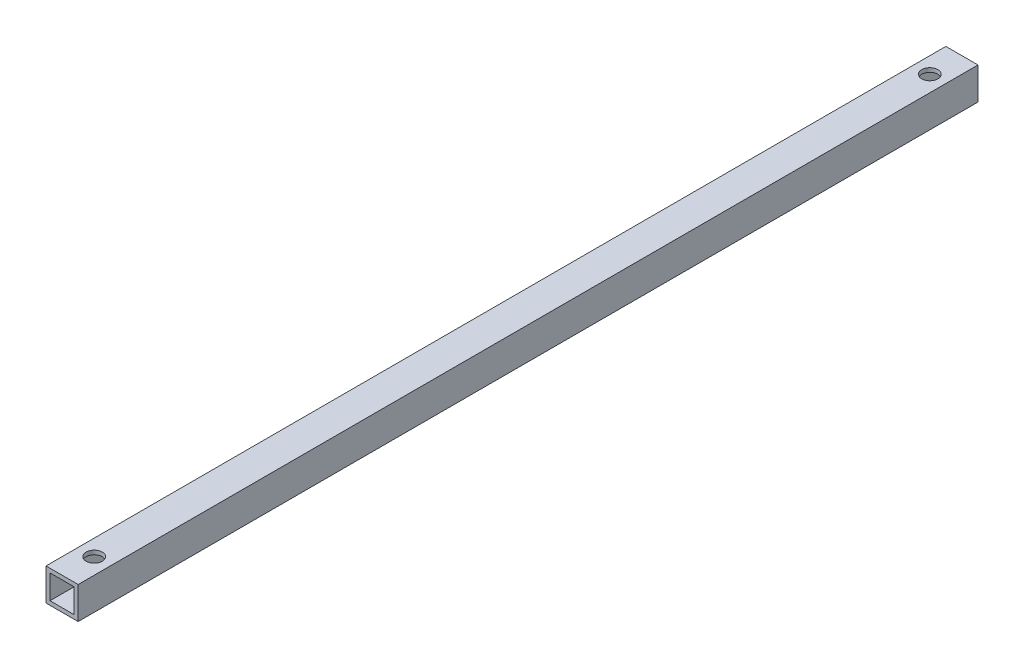
ISO-10303-21;
HEADER;
FILE_DESCRIPTION(('STEP AP214'),'2;1');
FILE_NAME('part.step','',(''),(''),'','','');
FILE_SCHEMA(('AUTOMOTIVE_DESIGN { 1 0 10303 214 1 1 1 1 }'));
ENDSEC;
DATA;
#1=APPLICATION_CONTEXT('core data for automotive mechanical design processes');
#2=APPLICATION_PROTOCOL_DEFINITION('international standard','automotive_design',2000,#1);
#3=PRODUCT_CONTEXT('',#1,'mechanical');
#4=PRODUCT('Part','Part','',(#3));
#5=PRODUCT_RELATED_PRODUCT_CATEGORY('part','',(#4));
#6=PRODUCT_DEFINITION_FORMATION('','',#4);
#7=PRODUCT_DEFINITION_CONTEXT('part definition',#1,'design');
#8=PRODUCT_DEFINITION('design','',#6,#7);
#9=PRODUCT_DEFINITION_SHAPE('','',#8);
#10=(LENGTH_UNIT() NAMED_UNIT(*) SI_UNIT(.MILLI.,.METRE.));
#11=(NAMED_UNIT(*) PLANE_ANGLE_UNIT() SI_UNIT($,.RADIAN.));
#12=(NAMED_UNIT(*) SI_UNIT($,.STERADIAN.) SOLID_ANGLE_UNIT());
#13=UNCERTAINTY_MEASURE_WITH_UNIT(LENGTH_MEASURE(1.E-05),#10,'distance_accuracy_value','');
#14=(GEOMETRIC_REPRESENTATION_CONTEXT(3) GLOBAL_UNCERTAINTY_ASSIGNED_CONTEXT((#13)) GLOBAL_UNIT_ASSIGNED_CONTEXT((#10,
#11,#12)) REPRESENTATION_CONTEXT('',''));
#15=CARTESIAN_POINT('',(0.,0.,0.));
#16=DIRECTION('',(0.,0.,1.));
#17=DIRECTION('',(1.,0.,0.));
#18=AXIS2_PLACEMENT_3D('',#15,#16,#17);
#19=CARTESIAN_POINT('',(0.,0.,355.6));
#20=DIRECTION('',(0.,0.,-1.));
#21=DIRECTION('',(-1.,0.,0.));
#22=AXIS2_PLACEMENT_3D('',#19,#20,#21);
#23=PLANE('',#22);
#24=DIRECTION('',(0.,1.,0.));
#25=VECTOR('',#24,1.);
#26=CARTESIAN_POINT('',(342.9,92.075,355.6));
#27=LINE('',#26,#25);
#28=CARTESIAN_POINT('',(342.9,66.675,355.6));
#29=VERTEX_POINT('',#28);
#30=CARTESIAN_POINT('',(342.9,92.075,355.6));
#31=VERTEX_POINT('',#30);
#32=EDGE_CURVE('E113',#29,#31,#27,.T.);
#33=ORIENTED_EDGE('',*,*,#32,.T.);
#34=DIRECTION('',(-1.,0.,0.));
#35=VECTOR('',#34,1.);
#36=CARTESIAN_POINT('',(342.9,92.075,355.6));
#37=LINE('',#36,#35);
#38=CARTESIAN_POINT('',(317.5,92.075,355.6));
#39=VERTEX_POINT('',#38);
#40=EDGE_CURVE('E160',#31,#39,#37,.T.);
#41=ORIENTED_EDGE('',*,*,#40,.T.);
#42=DIRECTION('',(0.,-1.,0.));
#43=VECTOR('',#42,1.);
#44=CARTESIAN_POINT('',(317.5,92.075,355.6));
#45=LINE('',#44,#43);
#46=CARTESIAN_POINT('',(317.5,66.675,355.6));
#47=VERTEX_POINT('',#46);
#48=EDGE_CURVE('E162',#39,#47,#45,.T.);
#49=ORIENTED_EDGE('',*,*,#48,.T.);
#50=DIRECTION('',(1.,0.,0.));
#51=VECTOR('',#50,1.);
#52=CARTESIAN_POINT('',(342.9,66.675,355.6));
#53=LINE('',#52,#51);
#54=EDGE_CURVE('E60',#47,#29,#53,.T.);
#55=ORIENTED_EDGE('',*,*,#54,.T.);
#56=EDGE_LOOP('',(#33,#41,#49,#55));
#57=FACE_BOUND('',#56,.T.);
#58=DIRECTION('',(0.,1.,0.));
#59=VECTOR('',#58,1.);
#60=CARTESIAN_POINT('',(339.725,88.9,355.6));
#61=LINE('',#60,#59);
#62=CARTESIAN_POINT('',(339.725,69.85,355.6));
#63=VERTEX_POINT('',#62);
#64=CARTESIAN_POINT('',(339.725,88.9,355.6));
#65=VERTEX_POINT('',#64);
#66=EDGE_CURVE('E110',#63,#65,#61,.T.);
#67=ORIENTED_EDGE('',*,*,#66,.F.);
#68=DIRECTION('',(1.,0.,0.));
#69=VECTOR('',#68,1.);
#70=CARTESIAN_POINT('',(339.725,69.85,355.6));
#71=LINE('',#70,#69);
#72=CARTESIAN_POINT('',(320.675,69.85,355.6));
#73=VERTEX_POINT('',#72);
#74=EDGE_CURVE('E153',#73,#63,#71,.T.);
#75=ORIENTED_EDGE('',*,*,#74,.F.);
#76=DIRECTION('',(0.,-1.,0.));
#77=VECTOR('',#76,1.);
#78=CARTESIAN_POINT('',(320.675,88.9,355.6));
#79=LINE('',#78,#77);
#80=CARTESIAN_POINT('',(320.675,88.9,355.6));
#81=VERTEX_POINT('',#80);
#82=EDGE_CURVE('E151',#81,#73,#79,.T.);
#83=ORIENTED_EDGE('',*,*,#82,.F.);
#84=DIRECTION('',(-1.,0.,0.));
#85=VECTOR('',#84,1.);
#86=CARTESIAN_POINT('',(339.725,88.9,355.6));
#87=LINE('',#86,#85);
#88=EDGE_CURVE('E149',#65,#81,#87,.T.);
#89=ORIENTED_EDGE('',*,*,#88,.F.);
#90=EDGE_LOOP('',(#67,#75,#83,#89));
#91=FACE_BOUND('',#90,.T.);
#92=ADVANCED_FACE('F35',(#57,#91),#23,.F.);
#93=CARTESIAN_POINT('',(342.9,92.075,355.6));
#94=DIRECTION('',(-1.,0.,0.));
#95=DIRECTION('',(0.,0.,1.));
#96=AXIS2_PLACEMENT_3D('',#93,#94,#95);
#97=PLANE('',#96);
#98=DIRECTION('',(0.,0.,-1.));
#99=VECTOR('',#98,1.);
#100=CARTESIAN_POINT('',(342.9,66.675,355.6));
#101=LINE('',#100,#99);
#102=CARTESIAN_POINT('',(342.9,66.675,-355.6));
#103=VERTEX_POINT('',#102);
#104=EDGE_CURVE('E165',#29,#103,#101,.T.);
#105=ORIENTED_EDGE('',*,*,#104,.T.);
#106=DIRECTION('',(0.,1.,0.));
#107=VECTOR('',#106,1.);
#108=CARTESIAN_POINT('',(342.9,92.075,-355.6));
#109=LINE('',#108,#107);
#110=CARTESIAN_POINT('',(342.9,92.075,-355.6));
#111=VERTEX_POINT('',#110);
#112=EDGE_CURVE('E136',#103,#111,#109,.T.);
#113=ORIENTED_EDGE('',*,*,#112,.T.);
#114=DIRECTION('',(0.,0.,-1.));
#115=VECTOR('',#114,1.);
#116=CARTESIAN_POINT('',(342.9,92.075,355.6));
#117=LINE('',#116,#115);
#118=EDGE_CURVE('E11',#31,#111,#117,.T.);
#119=ORIENTED_EDGE('',*,*,#118,.F.);
#120=ORIENTED_EDGE('',*,*,#32,.F.);
#121=EDGE_LOOP('',(#105,#113,#119,#120));
#122=FACE_BOUND('',#121,.T.);
#123=ADVANCED_FACE('F37',(#122),#97,.F.);
#124=CARTESIAN_POINT('',(342.9,92.075,355.6));
#125=DIRECTION('',(0.,-1.,0.));
#126=DIRECTION('',(0.,0.,-1.));
#127=AXIS2_PLACEMENT_3D('',#124,#125,#126);
#128=PLANE('',#127);
#129=CARTESIAN_POINT('',(330.2,92.075,330.2));
#130=DIRECTION('',(0.,1.,0.));
#131=DIRECTION('',(0.,0.,1.));
#132=AXIS2_PLACEMENT_3D('',#129,#130,#131);
#133=CIRCLE('',#132,6.34999999999999);
#134=CARTESIAN_POINT('',(330.2,92.075,336.55));
#135=VERTEX_POINT('',#134);
#136=EDGE_CURVE('E177',#135,#135,#133,.T.);
#137=ORIENTED_EDGE('',*,*,#136,.F.);
#138=EDGE_LOOP('',(#137));
#139=FACE_BOUND('',#138,.T.);
#140=CARTESIAN_POINT('',(330.2,92.075,-330.2));
#141=DIRECTION('',(0.,1.,0.));
#142=DIRECTION('',(0.,0.,1.));
#143=AXIS2_PLACEMENT_3D('',#140,#141,#142);
#144=CIRCLE('',#143,6.34999999999999);
#145=CARTESIAN_POINT('',(330.2,92.075,-323.85));
#146=VERTEX_POINT('',#145);
#147=EDGE_CURVE('E187',#146,#146,#144,.T.);
#148=ORIENTED_EDGE('',*,*,#147,.F.);
#149=EDGE_LOOP('',(#148));
#150=FACE_BOUND('',#149,.T.);
#151=ORIENTED_EDGE('',*,*,#118,.T.);
#152=DIRECTION('',(-1.,0.,0.));
#153=VECTOR('',#152,1.);
#154=CARTESIAN_POINT('',(342.9,92.075,-355.6));
#155=LINE('',#154,#153);
#156=CARTESIAN_POINT('',(317.5,92.075,-355.6));
#157=VERTEX_POINT('',#156);
#158=EDGE_CURVE('E139',#111,#157,#155,.T.);
#159=ORIENTED_EDGE('',*,*,#158,.T.);
#160=DIRECTION('',(0.,0.,-1.));
#161=VECTOR('',#160,1.);
#162=CARTESIAN_POINT('',(317.5,92.075,355.6));
#163=LINE('',#162,#161);
#164=EDGE_CURVE('E44',#39,#157,#163,.T.);
#165=ORIENTED_EDGE('',*,*,#164,.F.);
#166=ORIENTED_EDGE('',*,*,#40,.F.);
#167=EDGE_LOOP('',(#151,#159,#165,#166));
#168=FACE_BOUND('',#167,.T.);
#169=ADVANCED_FACE('F193',(#139,#150,#168),#128,.F.);
#170=CARTESIAN_POINT('',(317.5,92.075,355.6));
#171=DIRECTION('',(1.,0.,0.));
#172=DIRECTION('',(0.,0.,-1.));
#173=AXIS2_PLACEMENT_3D('',#170,#171,#172);
#174=PLANE('',#173);
#175=ORIENTED_EDGE('',*,*,#164,.T.);
#176=DIRECTION('',(0.,-1.,0.));
#177=VECTOR('',#176,1.);
#178=CARTESIAN_POINT('',(317.5,92.075,-355.6));
#179=LINE('',#178,#177);
#180=CARTESIAN_POINT('',(317.5,66.675,-355.6));
#181=VERTEX_POINT('',#180);
#182=EDGE_CURVE('E142',#157,#181,#179,.T.);
#183=ORIENTED_EDGE('',*,*,#182,.T.);
#184=DIRECTION('',(0.,0.,-1.));
#185=VECTOR('',#184,1.);
#186=CARTESIAN_POINT('',(317.5,66.675,355.6));
#187=LINE('',#186,#185);
#188=EDGE_CURVE('E167',#47,#181,#187,.T.);
#189=ORIENTED_EDGE('',*,*,#188,.F.);
#190=ORIENTED_EDGE('',*,*,#48,.F.);
#191=EDGE_LOOP('',(#175,#183,#189,#190));
#192=FACE_BOUND('',#191,.T.);
#193=ADVANCED_FACE('F196',(#192),#174,.F.);
#194=CARTESIAN_POINT('',(342.9,66.675,355.6));
#195=DIRECTION('',(0.,1.,0.));
#196=DIRECTION('',(0.,0.,1.));
#197=AXIS2_PLACEMENT_3D('',#194,#195,#196);
#198=PLANE('',#197);
#199=CARTESIAN_POINT('',(330.2,66.675,330.2));
#200=DIRECTION('',(0.,1.,0.));
#201=DIRECTION('',(0.,0.,1.));
#202=AXIS2_PLACEMENT_3D('',#199,#200,#201);
#203=CIRCLE('',#202,6.34999999999999);
#204=CARTESIAN_POINT('',(330.2,66.675,336.55));
#205=VERTEX_POINT('',#204);
#206=EDGE_CURVE('E172',#205,#205,#203,.T.);
#207=ORIENTED_EDGE('',*,*,#206,.T.);
#208=EDGE_LOOP('',(#207));
#209=FACE_BOUND('',#208,.T.);
#210=CARTESIAN_POINT('',(330.2,66.675,-330.2));
#211=DIRECTION('',(0.,1.,0.));
#212=DIRECTION('',(0.,0.,1.));
#213=AXIS2_PLACEMENT_3D('',#210,#211,#212);
#214=CIRCLE('',#213,6.34999999999999);
#215=CARTESIAN_POINT('',(330.2,66.675,-323.85));
#216=VERTEX_POINT('',#215);
#217=EDGE_CURVE('E182',#216,#216,#214,.T.);
#218=ORIENTED_EDGE('',*,*,#217,.T.);
#219=EDGE_LOOP('',(#218));
#220=FACE_BOUND('',#219,.T.);
#221=ORIENTED_EDGE('',*,*,#188,.T.);
#222=DIRECTION('',(1.,0.,0.));
#223=VECTOR('',#222,1.);
#224=CARTESIAN_POINT('',(342.9,66.675,-355.6));
#225=LINE('',#224,#223);
#226=EDGE_CURVE('E145',#181,#103,#225,.T.);
#227=ORIENTED_EDGE('',*,*,#226,.T.);
#228=ORIENTED_EDGE('',*,*,#104,.F.);
#229=ORIENTED_EDGE('',*,*,#54,.F.);
#230=EDGE_LOOP('',(#221,#227,#228,#229));
#231=FACE_BOUND('',#230,.T.);
#232=ADVANCED_FACE('F207',(#209,#220,#231),#198,.F.);
#233=CARTESIAN_POINT('',(339.725,88.9,355.6));
#234=DIRECTION('',(-1.,0.,0.));
#235=DIRECTION('',(0.,0.,1.));
#236=AXIS2_PLACEMENT_3D('',#233,#234,#235);
#237=PLANE('',#236);
#238=DIRECTION('',(0.,0.,-1.));
#239=VECTOR('',#238,1.);
#240=CARTESIAN_POINT('',(339.725,88.9,355.6));
#241=LINE('',#240,#239);
#242=CARTESIAN_POINT('',(339.725,88.9,-355.6));
#243=VERTEX_POINT('',#242);
#244=EDGE_CURVE('E102',#65,#243,#241,.T.);
#245=ORIENTED_EDGE('',*,*,#244,.T.);
#246=DIRECTION('',(0.,1.,0.));
#247=VECTOR('',#246,1.);
#248=CARTESIAN_POINT('',(339.725,88.9,-355.6));
#249=LINE('',#248,#247);
#250=CARTESIAN_POINT('',(339.725,69.85,-355.6));
#251=VERTEX_POINT('',#250);
#252=EDGE_CURVE('E107',#251,#243,#249,.T.);
#253=ORIENTED_EDGE('',*,*,#252,.F.);
#254=DIRECTION('',(0.,0.,-1.));
#255=VECTOR('',#254,1.);
#256=CARTESIAN_POINT('',(339.725,69.85,355.6));
#257=LINE('',#256,#255);
#258=EDGE_CURVE('E155',#63,#251,#257,.T.);
#259=ORIENTED_EDGE('',*,*,#258,.F.);
#260=ORIENTED_EDGE('',*,*,#66,.T.);
#261=EDGE_LOOP('',(#245,#253,#259,#260));
#262=FACE_BOUND('',#261,.T.);
#263=ADVANCED_FACE('F104',(#262),#237,.T.);
#264=CARTESIAN_POINT('',(339.725,88.9,355.6));
#265=DIRECTION('',(0.,-1.,0.));
#266=DIRECTION('',(0.,0.,-1.));
#267=AXIS2_PLACEMENT_3D('',#264,#265,#266);
#268=PLANE('',#267);
#269=CARTESIAN_POINT('',(330.2,88.9,330.2));
#270=DIRECTION('',(0.,-1.,0.));
#271=DIRECTION('',(0.,0.,-1.));
#272=AXIS2_PLACEMENT_3D('',#269,#270,#271);
#273=CIRCLE('',#272,6.34999999999999);
#274=CARTESIAN_POINT('',(330.2,88.9,323.85));
#275=VERTEX_POINT('',#274);
#276=EDGE_CURVE('E128',#275,#275,#273,.T.);
#277=ORIENTED_EDGE('',*,*,#276,.F.);
#278=EDGE_LOOP('',(#277));
#279=FACE_BOUND('',#278,.T.);
#280=CARTESIAN_POINT('',(330.2,88.9,-330.2));
#281=DIRECTION('',(0.,-1.,0.));
#282=DIRECTION('',(0.,0.,-1.));
#283=AXIS2_PLACEMENT_3D('',#280,#281,#282);
#284=CIRCLE('',#283,6.34999999999999);
#285=CARTESIAN_POINT('',(330.2,88.9,-336.55));
#286=VERTEX_POINT('',#285);
#287=EDGE_CURVE('E171',#286,#286,#284,.T.);
#288=ORIENTED_EDGE('',*,*,#287,.F.);
#289=EDGE_LOOP('',(#288));
#290=FACE_BOUND('',#289,.T.);
#291=DIRECTION('',(0.,0.,-1.));
#292=VECTOR('',#291,1.);
#293=CARTESIAN_POINT('',(320.675,88.9,355.6));
#294=LINE('',#293,#292);
#295=CARTESIAN_POINT('',(320.675,88.9,-355.6));
#296=VERTEX_POINT('',#295);
#297=EDGE_CURVE('E114',#81,#296,#294,.T.);
#298=ORIENTED_EDGE('',*,*,#297,.T.);
#299=DIRECTION('',(-1.,0.,0.));
#300=VECTOR('',#299,1.);
#301=CARTESIAN_POINT('',(339.725,88.9,-355.6));
#302=LINE('',#301,#300);
#303=EDGE_CURVE('E117',#243,#296,#302,.T.);
#304=ORIENTED_EDGE('',*,*,#303,.F.);
#305=ORIENTED_EDGE('',*,*,#244,.F.);
#306=ORIENTED_EDGE('',*,*,#88,.T.);
#307=EDGE_LOOP('',(#298,#304,#305,#306));
#308=FACE_BOUND('',#307,.T.);
#309=ADVANCED_FACE('F118',(#279,#290,#308),#268,.T.);
#310=CARTESIAN_POINT('',(320.675,88.9,355.6));
#311=DIRECTION('',(1.,0.,0.));
#312=DIRECTION('',(0.,0.,-1.));
#313=AXIS2_PLACEMENT_3D('',#310,#311,#312);
#314=PLANE('',#313);
#315=DIRECTION('',(0.,0.,-1.));
#316=VECTOR('',#315,1.);
#317=CARTESIAN_POINT('',(320.675,69.85,355.6));
#318=LINE('',#317,#316);
#319=CARTESIAN_POINT('',(320.675,69.85,-355.6));
#320=VERTEX_POINT('',#319);
#321=EDGE_CURVE('E52',#73,#320,#318,.T.);
#322=ORIENTED_EDGE('',*,*,#321,.T.);
#323=DIRECTION('',(0.,-1.,0.));
#324=VECTOR('',#323,1.);
#325=CARTESIAN_POINT('',(320.675,88.9,-355.6));
#326=LINE('',#325,#324);
#327=EDGE_CURVE('E123',#296,#320,#326,.T.);
#328=ORIENTED_EDGE('',*,*,#327,.F.);
#329=ORIENTED_EDGE('',*,*,#297,.F.);
#330=ORIENTED_EDGE('',*,*,#82,.T.);
#331=EDGE_LOOP('',(#322,#328,#329,#330));
#332=FACE_BOUND('',#331,.T.);
#333=ADVANCED_FACE('F217',(#332),#314,.T.);
#334=CARTESIAN_POINT('',(339.725,69.85,355.6));
#335=DIRECTION('',(0.,1.,0.));
#336=DIRECTION('',(0.,0.,1.));
#337=AXIS2_PLACEMENT_3D('',#334,#335,#336);
#338=PLANE('',#337);
#339=CARTESIAN_POINT('',(330.2,69.85,330.2));
#340=DIRECTION('',(0.,1.,0.));
#341=DIRECTION('',(0.,0.,1.));
#342=AXIS2_PLACEMENT_3D('',#339,#340,#341);
#343=CIRCLE('',#342,6.34999999999999);
#344=CARTESIAN_POINT('',(330.2,69.85,336.55));
#345=VERTEX_POINT('',#344);
#346=EDGE_CURVE('E39',#345,#345,#343,.T.);
#347=ORIENTED_EDGE('',*,*,#346,.F.);
#348=EDGE_LOOP('',(#347));
#349=FACE_BOUND('',#348,.T.);
#350=CARTESIAN_POINT('',(330.2,69.85,-330.2));
#351=DIRECTION('',(0.,1.,0.));
#352=DIRECTION('',(0.,0.,1.));
#353=AXIS2_PLACEMENT_3D('',#350,#351,#352);
#354=CIRCLE('',#353,6.34999999999999);
#355=CARTESIAN_POINT('',(330.2,69.85,-323.85));
#356=VERTEX_POINT('',#355);
#357=EDGE_CURVE('E169',#356,#356,#354,.T.);
#358=ORIENTED_EDGE('',*,*,#357,.F.);
#359=EDGE_LOOP('',(#358));
#360=FACE_BOUND('',#359,.T.);
#361=ORIENTED_EDGE('',*,*,#258,.T.);
#362=DIRECTION('',(1.,0.,0.));
#363=VECTOR('',#362,1.);
#364=CARTESIAN_POINT('',(339.725,69.85,-355.6));
#365=LINE('',#364,#363);
#366=EDGE_CURVE('E127',#320,#251,#365,.T.);
#367=ORIENTED_EDGE('',*,*,#366,.F.);
#368=ORIENTED_EDGE('',*,*,#321,.F.);
#369=ORIENTED_EDGE('',*,*,#74,.T.);
#370=EDGE_LOOP('',(#361,#367,#368,#369));
#371=FACE_BOUND('',#370,.T.);
#372=ADVANCED_FACE('F218',(#349,#360,#371),#338,.T.);
#373=CARTESIAN_POINT('',(0.,0.,-355.6));
#374=DIRECTION('',(0.,0.,-1.));
#375=DIRECTION('',(-1.,0.,0.));
#376=AXIS2_PLACEMENT_3D('',#373,#374,#375);
#377=PLANE('',#376);
#378=ORIENTED_EDGE('',*,*,#252,.T.);
#379=ORIENTED_EDGE('',*,*,#303,.T.);
#380=ORIENTED_EDGE('',*,*,#327,.T.);
#381=ORIENTED_EDGE('',*,*,#366,.T.);
#382=EDGE_LOOP('',(#378,#379,#380,#381));
#383=FACE_BOUND('',#382,.T.);
#384=ORIENTED_EDGE('',*,*,#112,.F.);
#385=ORIENTED_EDGE('',*,*,#226,.F.);
#386=ORIENTED_EDGE('',*,*,#182,.F.);
#387=ORIENTED_EDGE('',*,*,#158,.F.);
#388=EDGE_LOOP('',(#384,#385,#386,#387));
#389=FACE_BOUND('',#388,.T.);
#390=ADVANCED_FACE('F125',(#383,#389),#377,.T.);
#391=CARTESIAN_POINT('',(330.2,66.675,-330.2));
#392=DIRECTION('',(0.,1.,0.));
#393=DIRECTION('',(0.,0.,1.));
#394=AXIS2_PLACEMENT_3D('',#391,#392,#393);
#395=CYLINDRICAL_SURFACE('',#394,6.34999999999999);
#396=ORIENTED_EDGE('',*,*,#357,.T.);
#397=EDGE_LOOP('',(#396));
#398=FACE_BOUND('',#397,.T.);
#399=ORIENTED_EDGE('',*,*,#217,.F.);
#400=EDGE_LOOP('',(#399));
#401=FACE_BOUND('',#400,.T.);
#402=ADVANCED_FACE('F227',(#398,#401),#395,.F.);
#403=CARTESIAN_POINT('',(330.2,66.675,330.2));
#404=DIRECTION('',(0.,1.,0.));
#405=DIRECTION('',(0.,0.,1.));
#406=AXIS2_PLACEMENT_3D('',#403,#404,#405);
#407=CYLINDRICAL_SURFACE('',#406,6.34999999999999);
#408=ORIENTED_EDGE('',*,*,#346,.T.);
#409=EDGE_LOOP('',(#408));
#410=FACE_BOUND('',#409,.T.);
#411=ORIENTED_EDGE('',*,*,#206,.F.);
#412=EDGE_LOOP('',(#411));
#413=FACE_BOUND('',#412,.T.);
#414=ADVANCED_FACE('F282',(#410,#413),#407,.F.);
#415=ORIENTED_EDGE('',*,*,#287,.T.);
#416=EDGE_LOOP('',(#415));
#417=FACE_BOUND('',#416,.T.);
#418=ORIENTED_EDGE('',*,*,#147,.T.);
#419=EDGE_LOOP('',(#418));
#420=FACE_BOUND('',#419,.T.);
#421=ADVANCED_FACE('F191',(#417,#420),#395,.F.);
#422=ORIENTED_EDGE('',*,*,#276,.T.);
#423=EDGE_LOOP('',(#422));
#424=FACE_BOUND('',#423,.T.);
#425=ORIENTED_EDGE('',*,*,#136,.T.);
#426=EDGE_LOOP('',(#425));
#427=FACE_BOUND('',#426,.T.);
#428=ADVANCED_FACE('F290',(#424,#427),#407,.F.);
#429=CLOSED_SHELL('',(#92,#123,#169,#193,#232,#263,#309,#333,#372,#390,#402,#414,#421,#428));
#430=MANIFOLD_SOLID_BREP('B2',#429);
#431=ADVANCED_BREP_SHAPE_REPRESENTATION('',(#18,#430),#14);
#432=SHAPE_DEFINITION_REPRESENTATION(#9,#431);
ENDSEC;
END-ISO-10303-21;
